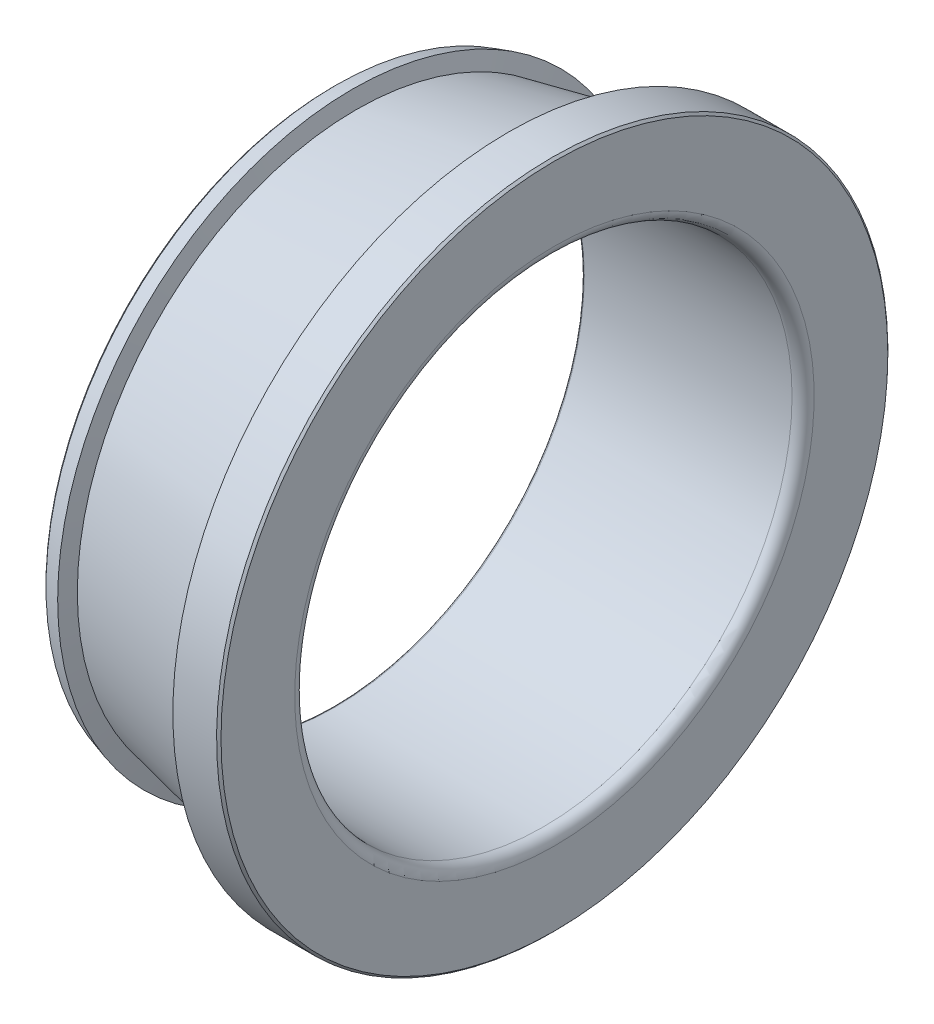
ISO-10303-21;
HEADER;
FILE_DESCRIPTION(('STEP AP214'),'2;1');
FILE_NAME('part.step','',(''),(''),'','','');
FILE_SCHEMA(('AUTOMOTIVE_DESIGN { 1 0 10303 214 1 1 1 1 }'));
ENDSEC;
DATA;
#1=APPLICATION_CONTEXT('core data for automotive mechanical design processes');
#2=APPLICATION_PROTOCOL_DEFINITION('international standard','automotive_design',2000,#1);
#3=PRODUCT_CONTEXT('',#1,'mechanical');
#4=PRODUCT('Part','Part','',(#3));
#5=PRODUCT_RELATED_PRODUCT_CATEGORY('part','',(#4));
#6=PRODUCT_DEFINITION_FORMATION('','',#4);
#7=PRODUCT_DEFINITION_CONTEXT('part definition',#1,'design');
#8=PRODUCT_DEFINITION('design','',#6,#7);
#9=PRODUCT_DEFINITION_SHAPE('','',#8);
#10=(LENGTH_UNIT() NAMED_UNIT(*) SI_UNIT(.MILLI.,.METRE.));
#11=(NAMED_UNIT(*) PLANE_ANGLE_UNIT() SI_UNIT($,.RADIAN.));
#12=(NAMED_UNIT(*) SI_UNIT($,.STERADIAN.) SOLID_ANGLE_UNIT());
#13=UNCERTAINTY_MEASURE_WITH_UNIT(LENGTH_MEASURE(1.E-05),#10,'distance_accuracy_value','');
#14=(GEOMETRIC_REPRESENTATION_CONTEXT(3) GLOBAL_UNCERTAINTY_ASSIGNED_CONTEXT((#13)) GLOBAL_UNIT_ASSIGNED_CONTEXT((#10,
#11,#12)) REPRESENTATION_CONTEXT('',''));
#15=CARTESIAN_POINT('',(0.,0.,0.));
#16=DIRECTION('',(0.,0.,1.));
#17=DIRECTION('',(1.,0.,0.));
#18=AXIS2_PLACEMENT_3D('',#15,#16,#17);
#19=CARTESIAN_POINT('',(7.075,0.,0.));
#20=DIRECTION('',(1.,0.,0.));
#21=DIRECTION('',(0.,1.,0.));
#22=AXIS2_PLACEMENT_3D('',#19,#20,#21);
#23=CONICAL_SURFACE('',#22,28.2825,0.294123543714793);
#24=CARTESIAN_POINT('',(0.2,0.,0.));
#25=DIRECTION('',(1.,0.,0.));
#26=DIRECTION('',(0.,1.,0.));
#27=AXIS2_PLACEMENT_3D('',#24,#25,#26);
#28=CIRCLE('',#27,26.2);
#29=CARTESIAN_POINT('',(0.2,26.2,0.));
#30=VERTEX_POINT('',#29);
#31=EDGE_CURVE('E11',#30,#30,#28,.T.);
#32=ORIENTED_EDGE('',*,*,#31,.T.);
#33=EDGE_LOOP('',(#32));
#34=FACE_BOUND('',#33,.T.);
#35=CARTESIAN_POINT('',(1.71776202466826,0.,0.));
#36=DIRECTION('',(-1.,0.,0.));
#37=DIRECTION('',(0.,1.,0.));
#38=AXIS2_PLACEMENT_3D('',#35,#36,#37);
#39=CIRCLE('',#38,26.6597439151086);
#40=CARTESIAN_POINT('',(1.71776202466826,-26.6597439151086,0.));
#41=VERTEX_POINT('',#40);
#42=EDGE_CURVE('E65',#41,#41,#39,.T.);
#43=ORIENTED_EDGE('',*,*,#42,.T.);
#44=EDGE_LOOP('',(#43));
#45=FACE_BOUND('',#44,.T.);
#46=ADVANCED_FACE('F17',(#34,#45),#23,.T.);
#47=CARTESIAN_POINT('',(0.1,0.,0.));
#48=DIRECTION('',(1.,0.,0.));
#49=DIRECTION('',(0.,1.,0.));
#50=AXIS2_PLACEMENT_3D('',#47,#48,#49);
#51=CONICAL_SURFACE('',#50,26.1,0.785398163397446);
#52=CARTESIAN_POINT('',(0.,0.,0.));
#53=DIRECTION('',(1.,0.,0.));
#54=DIRECTION('',(0.,1.,0.));
#55=AXIS2_PLACEMENT_3D('',#52,#53,#54);
#56=CIRCLE('',#55,26.);
#57=CARTESIAN_POINT('',(0.,26.,0.));
#58=VERTEX_POINT('',#57);
#59=EDGE_CURVE('E20',#58,#58,#56,.T.);
#60=ORIENTED_EDGE('',*,*,#59,.T.);
#61=EDGE_LOOP('',(#60));
#62=FACE_BOUND('',#61,.T.);
#63=ORIENTED_EDGE('',*,*,#31,.F.);
#64=EDGE_LOOP('',(#63));
#65=FACE_BOUND('',#64,.T.);
#66=ADVANCED_FACE('F108',(#62,#65),#51,.T.);
#67=CARTESIAN_POINT('',(0.,24.35,0.));
#68=DIRECTION('',(-1.,0.,0.));
#69=DIRECTION('',(0.,-1.,0.));
#70=AXIS2_PLACEMENT_3D('',#67,#68,#69);
#71=PLANE('',#70);
#72=CARTESIAN_POINT('',(0.,0.,0.));
#73=DIRECTION('',(1.,0.,0.));
#74=DIRECTION('',(0.,1.,0.));
#75=AXIS2_PLACEMENT_3D('',#72,#73,#74);
#76=CIRCLE('',#75,22.7);
#77=CARTESIAN_POINT('',(0.,22.7,0.));
#78=VERTEX_POINT('',#77);
#79=EDGE_CURVE('E49',#78,#78,#76,.T.);
#80=ORIENTED_EDGE('',*,*,#79,.T.);
#81=EDGE_LOOP('',(#80));
#82=FACE_BOUND('',#81,.T.);
#83=ORIENTED_EDGE('',*,*,#59,.F.);
#84=EDGE_LOOP('',(#83));
#85=FACE_BOUND('',#84,.T.);
#86=ADVANCED_FACE('F112',(#82,#85),#71,.T.);
#87=CARTESIAN_POINT('',(0.2,0.,0.));
#88=DIRECTION('',(1.,0.,0.));
#89=DIRECTION('',(0.,0.,-1.));
#90=AXIS2_PLACEMENT_3D('',#87,#88,#89);
#91=TOROIDAL_SURFACE('',#90,22.7,0.2);
#92=CARTESIAN_POINT('',(0.2,0.,0.));
#93=DIRECTION('',(1.,0.,0.));
#94=DIRECTION('',(0.,1.,0.));
#95=AXIS2_PLACEMENT_3D('',#92,#93,#94);
#96=CIRCLE('',#95,22.5);
#97=CARTESIAN_POINT('',(0.2,22.5,0.));
#98=VERTEX_POINT('',#97);
#99=EDGE_CURVE('E54',#98,#98,#96,.T.);
#100=ORIENTED_EDGE('',*,*,#99,.T.);
#101=EDGE_LOOP('',(#100));
#102=FACE_BOUND('',#101,.T.);
#103=ORIENTED_EDGE('',*,*,#79,.F.);
#104=EDGE_LOOP('',(#103));
#105=FACE_BOUND('',#104,.T.);
#106=ADVANCED_FACE('F117',(#102,#105),#91,.T.);
#107=CARTESIAN_POINT('',(9.6,0.,0.));
#108=DIRECTION('',(-1.,0.,0.));
#109=DIRECTION('',(0.,1.,0.));
#110=AXIS2_PLACEMENT_3D('',#107,#108,#109);
#111=CYLINDRICAL_SURFACE('',#110,22.5);
#112=CARTESIAN_POINT('',(19.,0.,0.));
#113=DIRECTION('',(1.,0.,0.));
#114=DIRECTION('',(0.,1.,0.));
#115=AXIS2_PLACEMENT_3D('',#112,#113,#114);
#116=CIRCLE('',#115,22.5);
#117=CARTESIAN_POINT('',(19.,22.5,0.));
#118=VERTEX_POINT('',#117);
#119=EDGE_CURVE('E82',#118,#118,#116,.T.);
#120=ORIENTED_EDGE('',*,*,#119,.T.);
#121=EDGE_LOOP('',(#120));
#122=FACE_BOUND('',#121,.T.);
#123=ORIENTED_EDGE('',*,*,#99,.F.);
#124=EDGE_LOOP('',(#123));
#125=FACE_BOUND('',#124,.T.);
#126=ADVANCED_FACE('F123',(#122,#125),#111,.F.);
#127=CARTESIAN_POINT('',(19.,0.,0.));
#128=DIRECTION('',(1.,0.,0.));
#129=DIRECTION('',(0.,0.,-1.));
#130=AXIS2_PLACEMENT_3D('',#127,#128,#129);
#131=TOROIDAL_SURFACE('',#130,23.5,1.);
#132=CARTESIAN_POINT('',(20.,0.,0.));
#133=DIRECTION('',(1.,0.,0.));
#134=DIRECTION('',(0.,1.,0.));
#135=AXIS2_PLACEMENT_3D('',#132,#133,#134);
#136=CIRCLE('',#135,23.5);
#137=CARTESIAN_POINT('',(20.,23.5,0.));
#138=VERTEX_POINT('',#137);
#139=EDGE_CURVE('E80',#138,#138,#136,.T.);
#140=ORIENTED_EDGE('',*,*,#139,.T.);
#141=EDGE_LOOP('',(#140));
#142=FACE_BOUND('',#141,.T.);
#143=ORIENTED_EDGE('',*,*,#119,.F.);
#144=EDGE_LOOP('',(#143));
#145=FACE_BOUND('',#144,.T.);
#146=ADVANCED_FACE('F126',(#142,#145),#131,.T.);
#147=CARTESIAN_POINT('',(20.,26.8325,0.));
#148=DIRECTION('',(1.,0.,0.));
#149=DIRECTION('',(0.,1.,0.));
#150=AXIS2_PLACEMENT_3D('',#147,#148,#149);
#151=PLANE('',#150);
#152=CARTESIAN_POINT('',(20.,0.,0.));
#153=DIRECTION('',(1.,0.,0.));
#154=DIRECTION('',(0.,1.,0.));
#155=AXIS2_PLACEMENT_3D('',#152,#153,#154);
#156=CIRCLE('',#155,30.165);
#157=CARTESIAN_POINT('',(20.,30.165,0.));
#158=VERTEX_POINT('',#157);
#159=EDGE_CURVE('E74',#158,#158,#156,.T.);
#160=ORIENTED_EDGE('',*,*,#159,.T.);
#161=EDGE_LOOP('',(#160));
#162=FACE_BOUND('',#161,.T.);
#163=ORIENTED_EDGE('',*,*,#139,.F.);
#164=EDGE_LOOP('',(#163));
#165=FACE_BOUND('',#164,.T.);
#166=ADVANCED_FACE('F130',(#162,#165),#151,.T.);
#167=CARTESIAN_POINT('',(19.9,0.,0.));
#168=DIRECTION('',(-1.,0.,0.));
#169=DIRECTION('',(0.,1.,0.));
#170=AXIS2_PLACEMENT_3D('',#167,#168,#169);
#171=CONICAL_SURFACE('',#170,30.265,0.785398163397448);
#172=CARTESIAN_POINT('',(19.8,0.,0.));
#173=DIRECTION('',(1.,0.,0.));
#174=DIRECTION('',(0.,1.,0.));
#175=AXIS2_PLACEMENT_3D('',#172,#173,#174);
#176=CIRCLE('',#175,30.365);
#177=CARTESIAN_POINT('',(19.8,30.365,0.));
#178=VERTEX_POINT('',#177);
#179=EDGE_CURVE('E72',#178,#178,#176,.T.);
#180=ORIENTED_EDGE('',*,*,#179,.T.);
#181=EDGE_LOOP('',(#180));
#182=FACE_BOUND('',#181,.T.);
#183=ORIENTED_EDGE('',*,*,#159,.F.);
#184=EDGE_LOOP('',(#183));
#185=FACE_BOUND('',#184,.T.);
#186=ADVANCED_FACE('F134',(#182,#185),#171,.T.);
#187=CARTESIAN_POINT('',(16.875,0.,0.));
#188=DIRECTION('',(-1.,0.,0.));
#189=DIRECTION('',(0.,1.,0.));
#190=AXIS2_PLACEMENT_3D('',#187,#188,#189);
#191=CYLINDRICAL_SURFACE('',#190,30.365);
#192=ORIENTED_EDGE('',*,*,#179,.F.);
#193=EDGE_LOOP('',(#192));
#194=FACE_BOUND('',#193,.T.);
#195=CARTESIAN_POINT('',(15.8449164972834,0.,0.));
#196=DIRECTION('',(1.,0.,0.));
#197=DIRECTION('',(0.,1.,0.));
#198=AXIS2_PLACEMENT_3D('',#195,#196,#197);
#199=CIRCLE('',#198,30.365);
#200=CARTESIAN_POINT('',(15.8449164972834,-30.365,0.));
#201=VERTEX_POINT('',#200);
#202=EDGE_CURVE('E69',#201,#201,#199,.T.);
#203=ORIENTED_EDGE('',*,*,#202,.T.);
#204=EDGE_LOOP('',(#203));
#205=FACE_BOUND('',#204,.T.);
#206=ADVANCED_FACE('F70',(#194,#205),#191,.T.);
#207=CARTESIAN_POINT('',(15.4989505593195,0.,0.));
#208=DIRECTION('',(-1.,0.,0.));
#209=DIRECTION('',(0.,1.,0.));
#210=AXIS2_PLACEMENT_3D('',#207,#208,#209);
#211=CONICAL_SURFACE('',#210,31.8399985646096,1.34040762954389);
#212=CARTESIAN_POINT('',(16.3552854383998,0.,0.));
#213=DIRECTION('',(1.,0.,0.));
#214=DIRECTION('',(0.,1.,0.));
#215=AXIS2_PLACEMENT_3D('',#212,#213,#214);
#216=CIRCLE('',#215,28.1890821625441);
#217=CARTESIAN_POINT('',(16.3552854383998,28.1890821625441,0.));
#218=VERTEX_POINT('',#217);
#219=EDGE_CURVE('E76',#218,#218,#216,.T.);
#220=ORIENTED_EDGE('',*,*,#219,.T.);
#221=EDGE_LOOP('',(#220));
#222=FACE_BOUND('',#221,.T.);
#223=ORIENTED_EDGE('',*,*,#202,.F.);
#224=EDGE_LOOP('',(#223));
#225=FACE_BOUND('',#224,.T.);
#226=ADVANCED_FACE('F97',(#222,#225),#211,.F.);
#227=CARTESIAN_POINT('',(1.28471603394463,0.,0.));
#228=DIRECTION('',(-1.,0.,0.));
#229=DIRECTION('',(0.,1.,0.));
#230=AXIS2_PLACEMENT_3D('',#227,#228,#229);
#231=CONICAL_SURFACE('',#230,28.5060014353904,1.34040762954389);
#232=CARTESIAN_POINT('',(2.05568612634663,0.,0.));
#233=DIRECTION('',(1.,0.,0.));
#234=DIRECTION('',(0.,1.,0.));
#235=AXIS2_PLACEMENT_3D('',#232,#233,#234);
#236=CIRCLE('',#235,25.2190310869731);
#237=CARTESIAN_POINT('',(2.05568612634663,25.2190310869731,0.));
#238=VERTEX_POINT('',#237);
#239=EDGE_CURVE('E85',#238,#238,#236,.T.);
#240=ORIENTED_EDGE('',*,*,#239,.F.);
#241=EDGE_LOOP('',(#240));
#242=FACE_BOUND('',#241,.T.);
#243=ORIENTED_EDGE('',*,*,#42,.F.);
#244=EDGE_LOOP('',(#243));
#245=FACE_BOUND('',#244,.T.);
#246=ADVANCED_FACE('F94',(#242,#245),#231,.T.);
#247=CARTESIAN_POINT('',(9.20548578237319,0.,0.));
#248=DIRECTION('',(1.,0.,0.));
#249=DIRECTION('',(0.,1.,0.));
#250=AXIS2_PLACEMENT_3D('',#247,#248,#249);
#251=CONICAL_SURFACE('',#250,26.7040566247586,0.204789953112008);
#252=ORIENTED_EDGE('',*,*,#219,.F.);
#253=EDGE_LOOP('',(#252));
#254=FACE_BOUND('',#253,.T.);
#255=ORIENTED_EDGE('',*,*,#239,.T.);
#256=EDGE_LOOP('',(#255));
#257=FACE_BOUND('',#256,.T.);
#258=ADVANCED_FACE('F92',(#254,#257),#251,.T.);
#259=CLOSED_SHELL('',(#46,#66,#86,#106,#126,#146,#166,#186,#206,#226,#246,#258));
#260=MANIFOLD_SOLID_BREP('B1',#259);
#261=ADVANCED_BREP_SHAPE_REPRESENTATION('',(#18,#260),#14);
#262=SHAPE_DEFINITION_REPRESENTATION(#9,#261);
ENDSEC;
END-ISO-10303-21;
